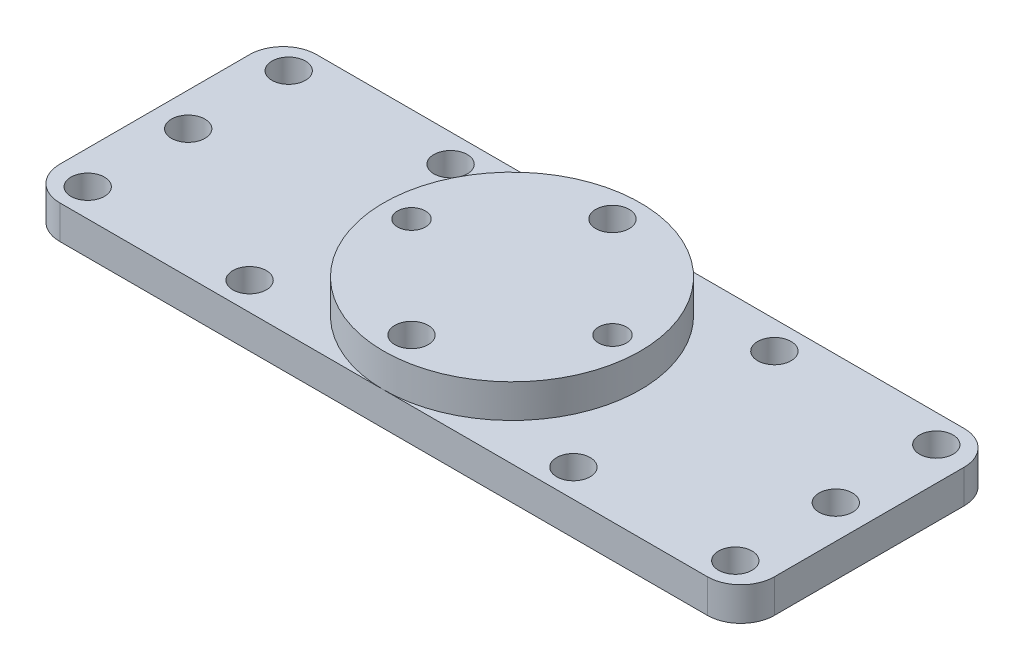
ISO-10303-21;
HEADER;
FILE_DESCRIPTION(('STEP AP214'),'2;1');
FILE_NAME('part.step','',(''),(''),'','','');
FILE_SCHEMA(('AUTOMOTIVE_DESIGN { 1 0 10303 214 1 1 1 1 }'));
ENDSEC;
DATA;
#1=APPLICATION_CONTEXT('core data for automotive mechanical design processes');
#2=APPLICATION_PROTOCOL_DEFINITION('international standard','automotive_design',2000,#1);
#3=PRODUCT_CONTEXT('',#1,'mechanical');
#4=PRODUCT('Part','Part','',(#3));
#5=PRODUCT_RELATED_PRODUCT_CATEGORY('part','',(#4));
#6=PRODUCT_DEFINITION_FORMATION('','',#4);
#7=PRODUCT_DEFINITION_CONTEXT('part definition',#1,'design');
#8=PRODUCT_DEFINITION('design','',#6,#7);
#9=PRODUCT_DEFINITION_SHAPE('','',#8);
#10=(LENGTH_UNIT() NAMED_UNIT(*) SI_UNIT(.MILLI.,.METRE.));
#11=(NAMED_UNIT(*) PLANE_ANGLE_UNIT() SI_UNIT($,.RADIAN.));
#12=(NAMED_UNIT(*) SI_UNIT($,.STERADIAN.) SOLID_ANGLE_UNIT());
#13=UNCERTAINTY_MEASURE_WITH_UNIT(LENGTH_MEASURE(1.E-05),#10,'distance_accuracy_value','');
#14=(GEOMETRIC_REPRESENTATION_CONTEXT(3) GLOBAL_UNCERTAINTY_ASSIGNED_CONTEXT((#13)) GLOBAL_UNIT_ASSIGNED_CONTEXT((#10,
#11,#12)) REPRESENTATION_CONTEXT('',''));
#15=CARTESIAN_POINT('',(0.,0.,0.));
#16=DIRECTION('',(0.,0.,1.));
#17=DIRECTION('',(1.,0.,0.));
#18=AXIS2_PLACEMENT_3D('',#15,#16,#17);
#19=CARTESIAN_POINT('',(0.,0.,0.));
#20=DIRECTION('',(0.,-1.,0.));
#21=DIRECTION('',(0.,0.,-1.));
#22=AXIS2_PLACEMENT_3D('',#19,#20,#21);
#23=PLANE('',#22);
#24=CARTESIAN_POINT('',(0.,0.,0.));
#25=DIRECTION('',(0.,1.,0.));
#26=DIRECTION('',(0.,0.,1.));
#27=AXIS2_PLACEMENT_3D('',#24,#25,#26);
#28=CIRCLE('',#27,11.5);
#29=CARTESIAN_POINT('',(0.,0.,11.5));
#30=VERTEX_POINT('',#29);
#31=CARTESIAN_POINT('',(0.,0.,-11.5));
#32=VERTEX_POINT('',#31);
#33=EDGE_CURVE('E66',#30,#32,#28,.T.);
#34=ORIENTED_EDGE('',*,*,#33,.F.);
#35=DIRECTION('',(1.,0.,0.));
#36=VECTOR('',#35,1.);
#37=CARTESIAN_POINT('',(-32.,0.,11.5));
#38=LINE('',#37,#36);
#39=CARTESIAN_POINT('',(29.,0.,11.5));
#40=VERTEX_POINT('',#39);
#41=EDGE_CURVE('E292',#30,#40,#38,.T.);
#42=ORIENTED_EDGE('',*,*,#41,.T.);
#43=CARTESIAN_POINT('',(29.,0.,8.5));
#44=DIRECTION('',(0.,-1.,0.));
#45=DIRECTION('',(0.,0.,-1.));
#46=AXIS2_PLACEMENT_3D('',#43,#44,#45);
#47=CIRCLE('',#46,3.);
#48=CARTESIAN_POINT('',(32.,0.,8.5));
#49=VERTEX_POINT('',#48);
#50=EDGE_CURVE('E304',#40,#49,#47,.F.);
#51=ORIENTED_EDGE('',*,*,#50,.T.);
#52=DIRECTION('',(0.,0.,-1.));
#53=VECTOR('',#52,1.);
#54=CARTESIAN_POINT('',(32.,0.,11.5));
#55=LINE('',#54,#53);
#56=CARTESIAN_POINT('',(32.,0.,-8.5));
#57=VERTEX_POINT('',#56);
#58=EDGE_CURVE('E262',#49,#57,#55,.T.);
#59=ORIENTED_EDGE('',*,*,#58,.T.);
#60=CARTESIAN_POINT('',(29.,0.,-8.5));
#61=DIRECTION('',(0.,-1.,0.));
#62=DIRECTION('',(0.,0.,-1.));
#63=AXIS2_PLACEMENT_3D('',#60,#61,#62);
#64=CIRCLE('',#63,3.);
#65=CARTESIAN_POINT('',(29.,0.,-11.5));
#66=VERTEX_POINT('',#65);
#67=EDGE_CURVE('E307',#57,#66,#64,.F.);
#68=ORIENTED_EDGE('',*,*,#67,.T.);
#69=DIRECTION('',(-1.,0.,0.));
#70=VECTOR('',#69,1.);
#71=CARTESIAN_POINT('',(-32.,0.,-11.5));
#72=LINE('',#71,#70);
#73=EDGE_CURVE('E284',#66,#32,#72,.T.);
#74=ORIENTED_EDGE('',*,*,#73,.T.);
#75=EDGE_LOOP('',(#34,#42,#51,#59,#68,#74));
#76=FACE_BOUND('',#75,.T.);
#77=CARTESIAN_POINT('',(29.,0.,-9.));
#78=DIRECTION('',(0.,1.,0.));
#79=DIRECTION('',(0.,0.,1.));
#80=AXIS2_PLACEMENT_3D('',#77,#78,#79);
#81=CIRCLE('',#80,1.49999999999999);
#82=CARTESIAN_POINT('',(29.,0.,-7.50000000000001));
#83=VERTEX_POINT('',#82);
#84=EDGE_CURVE('E190',#83,#83,#81,.T.);
#85=ORIENTED_EDGE('',*,*,#84,.F.);
#86=EDGE_LOOP('',(#85));
#87=FACE_BOUND('',#86,.T.);
#88=CARTESIAN_POINT('',(14.5,0.,-9.));
#89=DIRECTION('',(0.,1.,0.));
#90=DIRECTION('',(0.,0.,1.));
#91=AXIS2_PLACEMENT_3D('',#88,#89,#90);
#92=CIRCLE('',#91,1.49999999999999);
#93=CARTESIAN_POINT('',(14.5,0.,-7.50000000000001));
#94=VERTEX_POINT('',#93);
#95=EDGE_CURVE('E198',#94,#94,#92,.T.);
#96=ORIENTED_EDGE('',*,*,#95,.F.);
#97=EDGE_LOOP('',(#96));
#98=FACE_BOUND('',#97,.T.);
#99=CARTESIAN_POINT('',(29.,0.,9.));
#100=DIRECTION('',(0.,1.,0.));
#101=DIRECTION('',(0.,0.,1.));
#102=AXIS2_PLACEMENT_3D('',#99,#100,#101);
#103=CIRCLE('',#102,1.49999999999999);
#104=CARTESIAN_POINT('',(29.,0.,10.5));
#105=VERTEX_POINT('',#104);
#106=EDGE_CURVE('E214',#105,#105,#103,.T.);
#107=ORIENTED_EDGE('',*,*,#106,.F.);
#108=EDGE_LOOP('',(#107));
#109=FACE_BOUND('',#108,.T.);
#110=CARTESIAN_POINT('',(14.5,0.,9.));
#111=DIRECTION('',(0.,1.,0.));
#112=DIRECTION('',(0.,0.,1.));
#113=AXIS2_PLACEMENT_3D('',#110,#111,#112);
#114=CIRCLE('',#113,1.49999999999999);
#115=CARTESIAN_POINT('',(14.5,0.,10.5));
#116=VERTEX_POINT('',#115);
#117=EDGE_CURVE('E206',#116,#116,#114,.T.);
#118=ORIENTED_EDGE('',*,*,#117,.F.);
#119=EDGE_LOOP('',(#118));
#120=FACE_BOUND('',#119,.T.);
#121=CARTESIAN_POINT('',(29.,0.,0.));
#122=DIRECTION('',(0.,1.,0.));
#123=DIRECTION('',(0.,0.,1.));
#124=AXIS2_PLACEMENT_3D('',#121,#122,#123);
#125=CIRCLE('',#124,1.49999999999999);
#126=CARTESIAN_POINT('',(29.,0.,1.49999999999999));
#127=VERTEX_POINT('',#126);
#128=EDGE_CURVE('E179',#127,#127,#125,.T.);
#129=ORIENTED_EDGE('',*,*,#128,.F.);
#130=EDGE_LOOP('',(#129));
#131=FACE_BOUND('',#130,.T.);
#132=ADVANCED_FACE('F55',(#76,#87,#98,#109,#120,#131),#23,.F.);
#133=EDGE_CURVE('E11',#32,#30,#28,.T.);
#134=ORIENTED_EDGE('',*,*,#133,.F.);
#135=CARTESIAN_POINT('',(-29.,0.,-11.5));
#136=VERTEX_POINT('',#135);
#137=EDGE_CURVE('E283',#32,#136,#72,.T.);
#138=ORIENTED_EDGE('',*,*,#137,.T.);
#139=CARTESIAN_POINT('',(-29.,0.,-8.5));
#140=DIRECTION('',(0.,-1.,0.));
#141=DIRECTION('',(0.,0.,-1.));
#142=AXIS2_PLACEMENT_3D('',#139,#140,#141);
#143=CIRCLE('',#142,3.);
#144=CARTESIAN_POINT('',(-32.,0.,-8.5));
#145=VERTEX_POINT('',#144);
#146=EDGE_CURVE('E310',#136,#145,#143,.F.);
#147=ORIENTED_EDGE('',*,*,#146,.T.);
#148=DIRECTION('',(0.,0.,1.));
#149=VECTOR('',#148,1.);
#150=CARTESIAN_POINT('',(-32.,0.,11.5));
#151=LINE('',#150,#149);
#152=CARTESIAN_POINT('',(-32.,0.,8.5));
#153=VERTEX_POINT('',#152);
#154=EDGE_CURVE('E288',#145,#153,#151,.T.);
#155=ORIENTED_EDGE('',*,*,#154,.T.);
#156=CARTESIAN_POINT('',(-29.,0.,8.5));
#157=DIRECTION('',(0.,-1.,0.));
#158=DIRECTION('',(0.,0.,-1.));
#159=AXIS2_PLACEMENT_3D('',#156,#157,#158);
#160=CIRCLE('',#159,3.);
#161=CARTESIAN_POINT('',(-29.,0.,11.5));
#162=VERTEX_POINT('',#161);
#163=EDGE_CURVE('E301',#153,#162,#160,.F.);
#164=ORIENTED_EDGE('',*,*,#163,.T.);
#165=EDGE_CURVE('E268',#162,#30,#38,.T.);
#166=ORIENTED_EDGE('',*,*,#165,.T.);
#167=EDGE_LOOP('',(#134,#138,#147,#155,#164,#166));
#168=FACE_BOUND('',#167,.T.);
#169=CARTESIAN_POINT('',(-29.,0.,9.));
#170=DIRECTION('',(0.,1.,0.));
#171=DIRECTION('',(0.,0.,1.));
#172=AXIS2_PLACEMENT_3D('',#169,#170,#171);
#173=CIRCLE('',#172,1.49999999999999);
#174=CARTESIAN_POINT('',(-29.,0.,10.5));
#175=VERTEX_POINT('',#174);
#176=EDGE_CURVE('E254',#175,#175,#173,.T.);
#177=ORIENTED_EDGE('',*,*,#176,.F.);
#178=EDGE_LOOP('',(#177));
#179=FACE_BOUND('',#178,.T.);
#180=CARTESIAN_POINT('',(-14.5,0.,9.));
#181=DIRECTION('',(0.,1.,0.));
#182=DIRECTION('',(0.,0.,1.));
#183=AXIS2_PLACEMENT_3D('',#180,#181,#182);
#184=CIRCLE('',#183,1.49999999999999);
#185=CARTESIAN_POINT('',(-14.5,0.,10.5));
#186=VERTEX_POINT('',#185);
#187=EDGE_CURVE('E246',#186,#186,#184,.T.);
#188=ORIENTED_EDGE('',*,*,#187,.F.);
#189=EDGE_LOOP('',(#188));
#190=FACE_BOUND('',#189,.T.);
#191=CARTESIAN_POINT('',(-14.5,0.,-9.));
#192=DIRECTION('',(0.,1.,0.));
#193=DIRECTION('',(0.,0.,1.));
#194=AXIS2_PLACEMENT_3D('',#191,#192,#193);
#195=CIRCLE('',#194,1.49999999999999);
#196=CARTESIAN_POINT('',(-14.5,0.,-7.50000000000001));
#197=VERTEX_POINT('',#196);
#198=EDGE_CURVE('E238',#197,#197,#195,.T.);
#199=ORIENTED_EDGE('',*,*,#198,.F.);
#200=EDGE_LOOP('',(#199));
#201=FACE_BOUND('',#200,.T.);
#202=CARTESIAN_POINT('',(-29.,0.,-9.));
#203=DIRECTION('',(0.,1.,0.));
#204=DIRECTION('',(0.,0.,1.));
#205=AXIS2_PLACEMENT_3D('',#202,#203,#204);
#206=CIRCLE('',#205,1.49999999999999);
#207=CARTESIAN_POINT('',(-29.,0.,-7.50000000000001));
#208=VERTEX_POINT('',#207);
#209=EDGE_CURVE('E230',#208,#208,#206,.T.);
#210=ORIENTED_EDGE('',*,*,#209,.F.);
#211=EDGE_LOOP('',(#210));
#212=FACE_BOUND('',#211,.T.);
#213=CARTESIAN_POINT('',(-29.,0.,0.));
#214=DIRECTION('',(0.,1.,0.));
#215=DIRECTION('',(0.,0.,1.));
#216=AXIS2_PLACEMENT_3D('',#213,#214,#215);
#217=CIRCLE('',#216,1.49999999999999);
#218=CARTESIAN_POINT('',(-29.,0.,1.49999999999999));
#219=VERTEX_POINT('',#218);
#220=EDGE_CURVE('E222',#219,#219,#217,.T.);
#221=ORIENTED_EDGE('',*,*,#220,.F.);
#222=EDGE_LOOP('',(#221));
#223=FACE_BOUND('',#222,.T.);
#224=ADVANCED_FACE('F482',(#168,#179,#190,#201,#212,#223),#23,.F.);
#225=CARTESIAN_POINT('',(32.,-3.,11.5));
#226=DIRECTION('',(1.,0.,0.));
#227=DIRECTION('',(0.,0.,-1.));
#228=AXIS2_PLACEMENT_3D('',#225,#226,#227);
#229=PLANE('',#228);
#230=DIRECTION('',(0.,0.,-1.));
#231=VECTOR('',#230,1.);
#232=CARTESIAN_POINT('',(32.,-3.,11.5));
#233=LINE('',#232,#231);
#234=CARTESIAN_POINT('',(32.,-3.,8.5));
#235=VERTEX_POINT('',#234);
#236=CARTESIAN_POINT('',(32.,-3.,-8.5));
#237=VERTEX_POINT('',#236);
#238=EDGE_CURVE('E263',#235,#237,#233,.T.);
#239=ORIENTED_EDGE('',*,*,#238,.T.);
#240=DIRECTION('',(0.,1.,0.));
#241=VECTOR('',#240,1.);
#242=CARTESIAN_POINT('',(32.,-3.,-8.5));
#243=LINE('',#242,#241);
#244=EDGE_CURVE('E334',#237,#57,#243,.T.);
#245=ORIENTED_EDGE('',*,*,#244,.T.);
#246=ORIENTED_EDGE('',*,*,#58,.F.);
#247=DIRECTION('',(0.,1.,0.));
#248=VECTOR('',#247,1.);
#249=CARTESIAN_POINT('',(32.,-3.,8.5));
#250=LINE('',#249,#248);
#251=EDGE_CURVE('E331',#49,#235,#250,.F.);
#252=ORIENTED_EDGE('',*,*,#251,.T.);
#253=EDGE_LOOP('',(#239,#245,#246,#252));
#254=FACE_BOUND('',#253,.T.);
#255=ADVANCED_FACE('F360',(#254),#229,.T.);
#256=CARTESIAN_POINT('',(-32.,-3.,11.5));
#257=DIRECTION('',(0.,0.,1.));
#258=DIRECTION('',(1.,0.,0.));
#259=AXIS2_PLACEMENT_3D('',#256,#257,#258);
#260=PLANE('',#259);
#261=DIRECTION('',(1.,0.,0.));
#262=VECTOR('',#261,1.);
#263=CARTESIAN_POINT('',(-32.,-3.,11.5));
#264=LINE('',#263,#262);
#265=CARTESIAN_POINT('',(-29.,-3.,11.5));
#266=VERTEX_POINT('',#265);
#267=CARTESIAN_POINT('',(29.,-3.,11.5));
#268=VERTEX_POINT('',#267);
#269=EDGE_CURVE('E276',#266,#268,#264,.T.);
#270=ORIENTED_EDGE('',*,*,#269,.T.);
#271=DIRECTION('',(0.,1.,0.));
#272=VECTOR('',#271,1.);
#273=CARTESIAN_POINT('',(29.,-3.,11.5));
#274=LINE('',#273,#272);
#275=EDGE_CURVE('E59',#268,#40,#274,.T.);
#276=ORIENTED_EDGE('',*,*,#275,.T.);
#277=ORIENTED_EDGE('',*,*,#41,.F.);
#278=ORIENTED_EDGE('',*,*,#165,.F.);
#279=DIRECTION('',(0.,1.,0.));
#280=VECTOR('',#279,1.);
#281=CARTESIAN_POINT('',(-29.,-3.,11.5));
#282=LINE('',#281,#280);
#283=EDGE_CURVE('E337',#162,#266,#282,.F.);
#284=ORIENTED_EDGE('',*,*,#283,.T.);
#285=EDGE_LOOP('',(#270,#276,#277,#278,#284));
#286=FACE_BOUND('',#285,.T.);
#287=ADVANCED_FACE('F350',(#286),#260,.T.);
#288=CARTESIAN_POINT('',(-32.,-3.,11.5));
#289=DIRECTION('',(-1.,0.,0.));
#290=DIRECTION('',(0.,0.,1.));
#291=AXIS2_PLACEMENT_3D('',#288,#289,#290);
#292=PLANE('',#291);
#293=ORIENTED_EDGE('',*,*,#154,.F.);
#294=DIRECTION('',(0.,1.,0.));
#295=VECTOR('',#294,1.);
#296=CARTESIAN_POINT('',(-32.,-3.,-8.5));
#297=LINE('',#296,#295);
#298=CARTESIAN_POINT('',(-32.,-3.,-8.5));
#299=VERTEX_POINT('',#298);
#300=EDGE_CURVE('E317',#145,#299,#297,.F.);
#301=ORIENTED_EDGE('',*,*,#300,.T.);
#302=DIRECTION('',(0.,0.,1.));
#303=VECTOR('',#302,1.);
#304=CARTESIAN_POINT('',(-32.,-3.,11.5));
#305=LINE('',#304,#303);
#306=CARTESIAN_POINT('',(-32.,-3.,8.5));
#307=VERTEX_POINT('',#306);
#308=EDGE_CURVE('E272',#299,#307,#305,.T.);
#309=ORIENTED_EDGE('',*,*,#308,.T.);
#310=DIRECTION('',(0.,1.,0.));
#311=VECTOR('',#310,1.);
#312=CARTESIAN_POINT('',(-32.,-3.,8.5));
#313=LINE('',#312,#311);
#314=EDGE_CURVE('E313',#307,#153,#313,.T.);
#315=ORIENTED_EDGE('',*,*,#314,.T.);
#316=EDGE_LOOP('',(#293,#301,#309,#315));
#317=FACE_BOUND('',#316,.T.);
#318=ADVANCED_FACE('F491',(#317),#292,.T.);
#319=CARTESIAN_POINT('',(-32.,-3.,-11.5));
#320=DIRECTION('',(0.,0.,-1.));
#321=DIRECTION('',(-1.,0.,0.));
#322=AXIS2_PLACEMENT_3D('',#319,#320,#321);
#323=PLANE('',#322);
#324=DIRECTION('',(-1.,0.,0.));
#325=VECTOR('',#324,1.);
#326=CARTESIAN_POINT('',(-32.,-3.,-11.5));
#327=LINE('',#326,#325);
#328=CARTESIAN_POINT('',(29.,-3.,-11.5));
#329=VERTEX_POINT('',#328);
#330=CARTESIAN_POINT('',(-29.,-3.,-11.5));
#331=VERTEX_POINT('',#330);
#332=EDGE_CURVE('E267',#329,#331,#327,.T.);
#333=ORIENTED_EDGE('',*,*,#332,.T.);
#334=DIRECTION('',(0.,1.,0.));
#335=VECTOR('',#334,1.);
#336=CARTESIAN_POINT('',(-29.,-3.,-11.5));
#337=LINE('',#336,#335);
#338=EDGE_CURVE('E297',#331,#136,#337,.T.);
#339=ORIENTED_EDGE('',*,*,#338,.T.);
#340=ORIENTED_EDGE('',*,*,#137,.F.);
#341=ORIENTED_EDGE('',*,*,#73,.F.);
#342=DIRECTION('',(0.,1.,0.));
#343=VECTOR('',#342,1.);
#344=CARTESIAN_POINT('',(29.,-3.,-11.5));
#345=LINE('',#344,#343);
#346=EDGE_CURVE('E279',#66,#329,#345,.F.);
#347=ORIENTED_EDGE('',*,*,#346,.T.);
#348=EDGE_LOOP('',(#333,#339,#340,#341,#347));
#349=FACE_BOUND('',#348,.T.);
#350=ADVANCED_FACE('F368',(#349),#323,.T.);
#351=CARTESIAN_POINT('',(0.,-3.,0.));
#352=DIRECTION('',(0.,-1.,0.));
#353=DIRECTION('',(0.,0.,-1.));
#354=AXIS2_PLACEMENT_3D('',#351,#352,#353);
#355=PLANE('',#354);
#356=CARTESIAN_POINT('',(0.,-3.,-9.));
#357=DIRECTION('',(0.,-1.,0.));
#358=DIRECTION('',(0.,0.,-1.));
#359=AXIS2_PLACEMENT_3D('',#356,#357,#358);
#360=CIRCLE('',#359,1.49999999999999);
#361=CARTESIAN_POINT('',(0.,-3.,-10.5));
#362=VERTEX_POINT('',#361);
#363=EDGE_CURVE('E164',#362,#362,#360,.T.);
#364=ORIENTED_EDGE('',*,*,#363,.F.);
#365=EDGE_LOOP('',(#364));
#366=FACE_BOUND('',#365,.T.);
#367=CARTESIAN_POINT('',(0.,-3.,9.));
#368=DIRECTION('',(0.,-1.,0.));
#369=DIRECTION('',(0.,0.,-1.));
#370=AXIS2_PLACEMENT_3D('',#367,#368,#369);
#371=CIRCLE('',#370,1.49999999999999);
#372=CARTESIAN_POINT('',(0.,-3.,7.50000000000001));
#373=VERTEX_POINT('',#372);
#374=EDGE_CURVE('E172',#373,#373,#371,.T.);
#375=ORIENTED_EDGE('',*,*,#374,.F.);
#376=EDGE_LOOP('',(#375));
#377=FACE_BOUND('',#376,.T.);
#378=CARTESIAN_POINT('',(29.,-3.,0.));
#379=DIRECTION('',(0.,-1.,0.));
#380=DIRECTION('',(0.,0.,-1.));
#381=AXIS2_PLACEMENT_3D('',#378,#379,#380);
#382=CIRCLE('',#381,1.49999999999999);
#383=CARTESIAN_POINT('',(29.,-3.,-1.49999999999999));
#384=VERTEX_POINT('',#383);
#385=EDGE_CURVE('E186',#384,#384,#382,.T.);
#386=ORIENTED_EDGE('',*,*,#385,.F.);
#387=EDGE_LOOP('',(#386));
#388=FACE_BOUND('',#387,.T.);
#389=CARTESIAN_POINT('',(29.,-3.,-9.));
#390=DIRECTION('',(0.,-1.,0.));
#391=DIRECTION('',(0.,0.,-1.));
#392=AXIS2_PLACEMENT_3D('',#389,#390,#391);
#393=CIRCLE('',#392,1.49999999999999);
#394=CARTESIAN_POINT('',(29.,-3.,-10.5));
#395=VERTEX_POINT('',#394);
#396=EDGE_CURVE('E194',#395,#395,#393,.T.);
#397=ORIENTED_EDGE('',*,*,#396,.F.);
#398=EDGE_LOOP('',(#397));
#399=FACE_BOUND('',#398,.T.);
#400=CARTESIAN_POINT('',(14.5,-3.,-9.));
#401=DIRECTION('',(0.,-1.,0.));
#402=DIRECTION('',(0.,0.,-1.));
#403=AXIS2_PLACEMENT_3D('',#400,#401,#402);
#404=CIRCLE('',#403,1.49999999999999);
#405=CARTESIAN_POINT('',(14.5,-3.,-10.5));
#406=VERTEX_POINT('',#405);
#407=EDGE_CURVE('E202',#406,#406,#404,.T.);
#408=ORIENTED_EDGE('',*,*,#407,.F.);
#409=EDGE_LOOP('',(#408));
#410=FACE_BOUND('',#409,.T.);
#411=CARTESIAN_POINT('',(14.5,-3.,9.));
#412=DIRECTION('',(0.,-1.,0.));
#413=DIRECTION('',(0.,0.,-1.));
#414=AXIS2_PLACEMENT_3D('',#411,#412,#413);
#415=CIRCLE('',#414,1.49999999999999);
#416=CARTESIAN_POINT('',(14.5,-3.,7.50000000000001));
#417=VERTEX_POINT('',#416);
#418=EDGE_CURVE('E210',#417,#417,#415,.T.);
#419=ORIENTED_EDGE('',*,*,#418,.F.);
#420=EDGE_LOOP('',(#419));
#421=FACE_BOUND('',#420,.T.);
#422=CARTESIAN_POINT('',(29.,-3.,9.));
#423=DIRECTION('',(0.,-1.,0.));
#424=DIRECTION('',(0.,0.,-1.));
#425=AXIS2_PLACEMENT_3D('',#422,#423,#424);
#426=CIRCLE('',#425,1.49999999999999);
#427=CARTESIAN_POINT('',(29.,-3.,7.50000000000001));
#428=VERTEX_POINT('',#427);
#429=EDGE_CURVE('E218',#428,#428,#426,.T.);
#430=ORIENTED_EDGE('',*,*,#429,.F.);
#431=EDGE_LOOP('',(#430));
#432=FACE_BOUND('',#431,.T.);
#433=CARTESIAN_POINT('',(-29.,-3.,0.));
#434=DIRECTION('',(0.,-1.,0.));
#435=DIRECTION('',(0.,0.,-1.));
#436=AXIS2_PLACEMENT_3D('',#433,#434,#435);
#437=CIRCLE('',#436,1.49999999999999);
#438=CARTESIAN_POINT('',(-29.,-3.,-1.49999999999999));
#439=VERTEX_POINT('',#438);
#440=EDGE_CURVE('E226',#439,#439,#437,.T.);
#441=ORIENTED_EDGE('',*,*,#440,.F.);
#442=EDGE_LOOP('',(#441));
#443=FACE_BOUND('',#442,.T.);
#444=CARTESIAN_POINT('',(-29.,-3.,-9.));
#445=DIRECTION('',(0.,-1.,0.));
#446=DIRECTION('',(0.,0.,-1.));
#447=AXIS2_PLACEMENT_3D('',#444,#445,#446);
#448=CIRCLE('',#447,1.49999999999999);
#449=CARTESIAN_POINT('',(-29.,-3.,-10.5));
#450=VERTEX_POINT('',#449);
#451=EDGE_CURVE('E234',#450,#450,#448,.T.);
#452=ORIENTED_EDGE('',*,*,#451,.F.);
#453=EDGE_LOOP('',(#452));
#454=FACE_BOUND('',#453,.T.);
#455=CARTESIAN_POINT('',(-14.5,-3.,-9.));
#456=DIRECTION('',(0.,-1.,0.));
#457=DIRECTION('',(0.,0.,-1.));
#458=AXIS2_PLACEMENT_3D('',#455,#456,#457);
#459=CIRCLE('',#458,1.49999999999999);
#460=CARTESIAN_POINT('',(-14.5,-3.,-10.5));
#461=VERTEX_POINT('',#460);
#462=EDGE_CURVE('E242',#461,#461,#459,.T.);
#463=ORIENTED_EDGE('',*,*,#462,.F.);
#464=EDGE_LOOP('',(#463));
#465=FACE_BOUND('',#464,.T.);
#466=CARTESIAN_POINT('',(-14.5,-3.,9.));
#467=DIRECTION('',(0.,-1.,0.));
#468=DIRECTION('',(0.,0.,-1.));
#469=AXIS2_PLACEMENT_3D('',#466,#467,#468);
#470=CIRCLE('',#469,1.49999999999999);
#471=CARTESIAN_POINT('',(-14.5,-3.,7.50000000000001));
#472=VERTEX_POINT('',#471);
#473=EDGE_CURVE('E250',#472,#472,#470,.T.);
#474=ORIENTED_EDGE('',*,*,#473,.F.);
#475=EDGE_LOOP('',(#474));
#476=FACE_BOUND('',#475,.T.);
#477=CARTESIAN_POINT('',(-29.,-3.,9.));
#478=DIRECTION('',(0.,-1.,0.));
#479=DIRECTION('',(0.,0.,-1.));
#480=AXIS2_PLACEMENT_3D('',#477,#478,#479);
#481=CIRCLE('',#480,1.49999999999999);
#482=CARTESIAN_POINT('',(-29.,-3.,7.50000000000001));
#483=VERTEX_POINT('',#482);
#484=EDGE_CURVE('E258',#483,#483,#481,.T.);
#485=ORIENTED_EDGE('',*,*,#484,.F.);
#486=EDGE_LOOP('',(#485));
#487=FACE_BOUND('',#486,.T.);
#488=ORIENTED_EDGE('',*,*,#308,.F.);
#489=CARTESIAN_POINT('',(-29.,-3.,-8.5));
#490=DIRECTION('',(0.,-1.,0.));
#491=DIRECTION('',(0.,0.,-1.));
#492=AXIS2_PLACEMENT_3D('',#489,#490,#491);
#493=CIRCLE('',#492,3.);
#494=EDGE_CURVE('E328',#299,#331,#493,.T.);
#495=ORIENTED_EDGE('',*,*,#494,.T.);
#496=ORIENTED_EDGE('',*,*,#332,.F.);
#497=CARTESIAN_POINT('',(29.,-3.,-8.5));
#498=DIRECTION('',(0.,-1.,0.));
#499=DIRECTION('',(0.,0.,-1.));
#500=AXIS2_PLACEMENT_3D('',#497,#498,#499);
#501=CIRCLE('',#500,3.);
#502=EDGE_CURVE('E325',#329,#237,#501,.T.);
#503=ORIENTED_EDGE('',*,*,#502,.T.);
#504=ORIENTED_EDGE('',*,*,#238,.F.);
#505=CARTESIAN_POINT('',(29.,-3.,8.5));
#506=DIRECTION('',(0.,-1.,0.));
#507=DIRECTION('',(0.,0.,-1.));
#508=AXIS2_PLACEMENT_3D('',#505,#506,#507);
#509=CIRCLE('',#508,3.);
#510=EDGE_CURVE('E79',#235,#268,#509,.T.);
#511=ORIENTED_EDGE('',*,*,#510,.T.);
#512=ORIENTED_EDGE('',*,*,#269,.F.);
#513=CARTESIAN_POINT('',(-29.,-3.,8.5));
#514=DIRECTION('',(0.,-1.,0.));
#515=DIRECTION('',(0.,0.,-1.));
#516=AXIS2_PLACEMENT_3D('',#513,#514,#515);
#517=CIRCLE('',#516,3.);
#518=EDGE_CURVE('E320',#266,#307,#517,.T.);
#519=ORIENTED_EDGE('',*,*,#518,.T.);
#520=EDGE_LOOP('',(#488,#495,#496,#503,#504,#511,#512,#519));
#521=FACE_BOUND('',#520,.T.);
#522=ADVANCED_FACE('F493',(#366,#377,#388,#399,#410,#421,#432,#443,#454,#465,#476,#487,#521),
#355,.T.);
#523=CARTESIAN_POINT('',(-29.,0.,9.));
#524=DIRECTION('',(0.,1.,0.));
#525=DIRECTION('',(0.,0.,1.));
#526=AXIS2_PLACEMENT_3D('',#523,#524,#525);
#527=CYLINDRICAL_SURFACE('',#526,1.49999999999999);
#528=ORIENTED_EDGE('',*,*,#176,.T.);
#529=EDGE_LOOP('',(#528));
#530=FACE_BOUND('',#529,.T.);
#531=ORIENTED_EDGE('',*,*,#484,.T.);
#532=EDGE_LOOP('',(#531));
#533=FACE_BOUND('',#532,.T.);
#534=ADVANCED_FACE('F674',(#530,#533),#527,.F.);
#535=CARTESIAN_POINT('',(-14.5,0.,9.));
#536=DIRECTION('',(0.,1.,0.));
#537=DIRECTION('',(0.,0.,1.));
#538=AXIS2_PLACEMENT_3D('',#535,#536,#537);
#539=CYLINDRICAL_SURFACE('',#538,1.49999999999999);
#540=ORIENTED_EDGE('',*,*,#187,.T.);
#541=EDGE_LOOP('',(#540));
#542=FACE_BOUND('',#541,.T.);
#543=ORIENTED_EDGE('',*,*,#473,.T.);
#544=EDGE_LOOP('',(#543));
#545=FACE_BOUND('',#544,.T.);
#546=ADVANCED_FACE('F671',(#542,#545),#539,.F.);
#547=CARTESIAN_POINT('',(-14.5,0.,-9.));
#548=DIRECTION('',(0.,1.,0.));
#549=DIRECTION('',(0.,0.,1.));
#550=AXIS2_PLACEMENT_3D('',#547,#548,#549);
#551=CYLINDRICAL_SURFACE('',#550,1.49999999999999);
#552=ORIENTED_EDGE('',*,*,#198,.T.);
#553=EDGE_LOOP('',(#552));
#554=FACE_BOUND('',#553,.T.);
#555=ORIENTED_EDGE('',*,*,#462,.T.);
#556=EDGE_LOOP('',(#555));
#557=FACE_BOUND('',#556,.T.);
#558=ADVANCED_FACE('F667',(#554,#557),#551,.F.);
#559=CARTESIAN_POINT('',(-29.,0.,-9.));
#560=DIRECTION('',(0.,1.,0.));
#561=DIRECTION('',(0.,0.,1.));
#562=AXIS2_PLACEMENT_3D('',#559,#560,#561);
#563=CYLINDRICAL_SURFACE('',#562,1.49999999999999);
#564=ORIENTED_EDGE('',*,*,#209,.T.);
#565=EDGE_LOOP('',(#564));
#566=FACE_BOUND('',#565,.T.);
#567=ORIENTED_EDGE('',*,*,#451,.T.);
#568=EDGE_LOOP('',(#567));
#569=FACE_BOUND('',#568,.T.);
#570=ADVANCED_FACE('F663',(#566,#569),#563,.F.);
#571=CARTESIAN_POINT('',(-29.,0.,0.));
#572=DIRECTION('',(0.,1.,0.));
#573=DIRECTION('',(0.,0.,1.));
#574=AXIS2_PLACEMENT_3D('',#571,#572,#573);
#575=CYLINDRICAL_SURFACE('',#574,1.49999999999999);
#576=ORIENTED_EDGE('',*,*,#220,.T.);
#577=EDGE_LOOP('',(#576));
#578=FACE_BOUND('',#577,.T.);
#579=ORIENTED_EDGE('',*,*,#440,.T.);
#580=EDGE_LOOP('',(#579));
#581=FACE_BOUND('',#580,.T.);
#582=ADVANCED_FACE('F659',(#578,#581),#575,.F.);
#583=CARTESIAN_POINT('',(29.,0.,9.));
#584=DIRECTION('',(0.,1.,0.));
#585=DIRECTION('',(0.,0.,1.));
#586=AXIS2_PLACEMENT_3D('',#583,#584,#585);
#587=CYLINDRICAL_SURFACE('',#586,1.49999999999999);
#588=ORIENTED_EDGE('',*,*,#106,.T.);
#589=EDGE_LOOP('',(#588));
#590=FACE_BOUND('',#589,.T.);
#591=ORIENTED_EDGE('',*,*,#429,.T.);
#592=EDGE_LOOP('',(#591));
#593=FACE_BOUND('',#592,.T.);
#594=ADVANCED_FACE('F655',(#590,#593),#587,.F.);
#595=CARTESIAN_POINT('',(14.5,0.,9.));
#596=DIRECTION('',(0.,1.,0.));
#597=DIRECTION('',(0.,0.,1.));
#598=AXIS2_PLACEMENT_3D('',#595,#596,#597);
#599=CYLINDRICAL_SURFACE('',#598,1.49999999999999);
#600=ORIENTED_EDGE('',*,*,#117,.T.);
#601=EDGE_LOOP('',(#600));
#602=FACE_BOUND('',#601,.T.);
#603=ORIENTED_EDGE('',*,*,#418,.T.);
#604=EDGE_LOOP('',(#603));
#605=FACE_BOUND('',#604,.T.);
#606=ADVANCED_FACE('F651',(#602,#605),#599,.F.);
#607=CARTESIAN_POINT('',(14.5,0.,-9.));
#608=DIRECTION('',(0.,1.,0.));
#609=DIRECTION('',(0.,0.,1.));
#610=AXIS2_PLACEMENT_3D('',#607,#608,#609);
#611=CYLINDRICAL_SURFACE('',#610,1.49999999999999);
#612=ORIENTED_EDGE('',*,*,#95,.T.);
#613=EDGE_LOOP('',(#612));
#614=FACE_BOUND('',#613,.T.);
#615=ORIENTED_EDGE('',*,*,#407,.T.);
#616=EDGE_LOOP('',(#615));
#617=FACE_BOUND('',#616,.T.);
#618=ADVANCED_FACE('F647',(#614,#617),#611,.F.);
#619=CARTESIAN_POINT('',(29.,0.,-9.));
#620=DIRECTION('',(0.,1.,0.));
#621=DIRECTION('',(0.,0.,1.));
#622=AXIS2_PLACEMENT_3D('',#619,#620,#621);
#623=CYLINDRICAL_SURFACE('',#622,1.49999999999999);
#624=ORIENTED_EDGE('',*,*,#84,.T.);
#625=EDGE_LOOP('',(#624));
#626=FACE_BOUND('',#625,.T.);
#627=ORIENTED_EDGE('',*,*,#396,.T.);
#628=EDGE_LOOP('',(#627));
#629=FACE_BOUND('',#628,.T.);
#630=ADVANCED_FACE('F643',(#626,#629),#623,.F.);
#631=CARTESIAN_POINT('',(29.,0.,0.));
#632=DIRECTION('',(0.,1.,0.));
#633=DIRECTION('',(0.,0.,1.));
#634=AXIS2_PLACEMENT_3D('',#631,#632,#633);
#635=CYLINDRICAL_SURFACE('',#634,1.49999999999999);
#636=ORIENTED_EDGE('',*,*,#128,.T.);
#637=EDGE_LOOP('',(#636));
#638=FACE_BOUND('',#637,.T.);
#639=ORIENTED_EDGE('',*,*,#385,.T.);
#640=EDGE_LOOP('',(#639));
#641=FACE_BOUND('',#640,.T.);
#642=ADVANCED_FACE('F523',(#638,#641),#635,.F.);
#643=CARTESIAN_POINT('',(-29.,-3.,-8.5));
#644=DIRECTION('',(0.,1.,0.));
#645=DIRECTION('',(0.,0.,1.));
#646=AXIS2_PLACEMENT_3D('',#643,#644,#645);
#647=CYLINDRICAL_SURFACE('',#646,3.);
#648=ORIENTED_EDGE('',*,*,#494,.F.);
#649=ORIENTED_EDGE('',*,*,#300,.F.);
#650=ORIENTED_EDGE('',*,*,#146,.F.);
#651=ORIENTED_EDGE('',*,*,#338,.F.);
#652=EDGE_LOOP('',(#648,#649,#650,#651));
#653=FACE_BOUND('',#652,.T.);
#654=ADVANCED_FACE('F488',(#653),#647,.T.);
#655=CARTESIAN_POINT('',(29.,-3.,-8.5));
#656=DIRECTION('',(0.,1.,0.));
#657=DIRECTION('',(0.,0.,1.));
#658=AXIS2_PLACEMENT_3D('',#655,#656,#657);
#659=CYLINDRICAL_SURFACE('',#658,3.);
#660=ORIENTED_EDGE('',*,*,#502,.F.);
#661=ORIENTED_EDGE('',*,*,#346,.F.);
#662=ORIENTED_EDGE('',*,*,#67,.F.);
#663=ORIENTED_EDGE('',*,*,#244,.F.);
#664=EDGE_LOOP('',(#660,#661,#662,#663));
#665=FACE_BOUND('',#664,.T.);
#666=ADVANCED_FACE('F364',(#665),#659,.T.);
#667=CARTESIAN_POINT('',(29.,-3.,8.5));
#668=DIRECTION('',(0.,1.,0.));
#669=DIRECTION('',(0.,0.,1.));
#670=AXIS2_PLACEMENT_3D('',#667,#668,#669);
#671=CYLINDRICAL_SURFACE('',#670,3.);
#672=ORIENTED_EDGE('',*,*,#510,.F.);
#673=ORIENTED_EDGE('',*,*,#251,.F.);
#674=ORIENTED_EDGE('',*,*,#50,.F.);
#675=ORIENTED_EDGE('',*,*,#275,.F.);
#676=EDGE_LOOP('',(#672,#673,#674,#675));
#677=FACE_BOUND('',#676,.T.);
#678=ADVANCED_FACE('F354',(#677),#671,.T.);
#679=CARTESIAN_POINT('',(-29.,-3.,8.5));
#680=DIRECTION('',(0.,1.,0.));
#681=DIRECTION('',(0.,0.,1.));
#682=AXIS2_PLACEMENT_3D('',#679,#680,#681);
#683=CYLINDRICAL_SURFACE('',#682,3.);
#684=ORIENTED_EDGE('',*,*,#518,.F.);
#685=ORIENTED_EDGE('',*,*,#283,.F.);
#686=ORIENTED_EDGE('',*,*,#163,.F.);
#687=ORIENTED_EDGE('',*,*,#314,.F.);
#688=EDGE_LOOP('',(#684,#685,#686,#687));
#689=FACE_BOUND('',#688,.T.);
#690=ADVANCED_FACE('F57',(#689),#683,.T.);
#691=CARTESIAN_POINT('',(0.,3.,0.));
#692=DIRECTION('',(0.,-1.,0.));
#693=DIRECTION('',(0.,0.,-1.));
#694=AXIS2_PLACEMENT_3D('',#691,#692,#693);
#695=CYLINDRICAL_SURFACE('',#694,11.5);
#696=CARTESIAN_POINT('',(0.,3.,0.));
#697=DIRECTION('',(0.,1.,0.));
#698=DIRECTION('',(0.,0.,1.));
#699=AXIS2_PLACEMENT_3D('',#696,#697,#698);
#700=CIRCLE('',#699,11.5);
#701=CARTESIAN_POINT('',(0.,3.,11.5));
#702=VERTEX_POINT('',#701);
#703=EDGE_CURVE('E176',#702,#702,#700,.T.);
#704=ORIENTED_EDGE('',*,*,#703,.F.);
#705=EDGE_LOOP('',(#704));
#706=FACE_BOUND('',#705,.T.);
#707=ORIENTED_EDGE('',*,*,#33,.T.);
#708=ORIENTED_EDGE('',*,*,#133,.T.);
#709=EDGE_LOOP('',(#707,#708));
#710=FACE_BOUND('',#709,.T.);
#711=ADVANCED_FACE('F497',(#706,#710),#695,.T.);
#712=CARTESIAN_POINT('',(0.,3.,0.));
#713=DIRECTION('',(0.,1.,0.));
#714=DIRECTION('',(0.,0.,1.));
#715=AXIS2_PLACEMENT_3D('',#712,#713,#714);
#716=PLANE('',#715);
#717=CARTESIAN_POINT('',(-9.,3.,0.));
#718=DIRECTION('',(0.,1.,0.));
#719=DIRECTION('',(0.,0.,1.));
#720=AXIS2_PLACEMENT_3D('',#717,#718,#719);
#721=CIRCLE('',#720,1.24999999999999);
#722=CARTESIAN_POINT('',(-9.,3.,1.24999999999999));
#723=VERTEX_POINT('',#722);
#724=EDGE_CURVE('E145',#723,#723,#721,.T.);
#725=ORIENTED_EDGE('',*,*,#724,.F.);
#726=EDGE_LOOP('',(#725));
#727=FACE_BOUND('',#726,.T.);
#728=CARTESIAN_POINT('',(9.,3.,0.));
#729=DIRECTION('',(0.,1.,0.));
#730=DIRECTION('',(0.,0.,1.));
#731=AXIS2_PLACEMENT_3D('',#728,#729,#730);
#732=CIRCLE('',#731,1.24999999999999);
#733=CARTESIAN_POINT('',(9.,3.,1.24999999999999));
#734=VERTEX_POINT('',#733);
#735=EDGE_CURVE('E144',#734,#734,#732,.T.);
#736=ORIENTED_EDGE('',*,*,#735,.F.);
#737=EDGE_LOOP('',(#736));
#738=FACE_BOUND('',#737,.T.);
#739=CARTESIAN_POINT('',(0.,3.,-9.));
#740=DIRECTION('',(0.,1.,0.));
#741=DIRECTION('',(0.,0.,1.));
#742=AXIS2_PLACEMENT_3D('',#739,#740,#741);
#743=CIRCLE('',#742,1.49999999999999);
#744=CARTESIAN_POINT('',(0.,3.,-7.50000000000001));
#745=VERTEX_POINT('',#744);
#746=EDGE_CURVE('E160',#745,#745,#743,.T.);
#747=ORIENTED_EDGE('',*,*,#746,.F.);
#748=EDGE_LOOP('',(#747));
#749=FACE_BOUND('',#748,.T.);
#750=CARTESIAN_POINT('',(0.,3.,9.));
#751=DIRECTION('',(0.,1.,0.));
#752=DIRECTION('',(0.,0.,1.));
#753=AXIS2_PLACEMENT_3D('',#750,#751,#752);
#754=CIRCLE('',#753,1.49999999999999);
#755=CARTESIAN_POINT('',(0.,3.,10.5));
#756=VERTEX_POINT('',#755);
#757=EDGE_CURVE('E168',#756,#756,#754,.T.);
#758=ORIENTED_EDGE('',*,*,#757,.F.);
#759=EDGE_LOOP('',(#758));
#760=FACE_BOUND('',#759,.T.);
#761=ORIENTED_EDGE('',*,*,#703,.T.);
#762=EDGE_LOOP('',(#761));
#763=FACE_BOUND('',#762,.T.);
#764=ADVANCED_FACE('F503',(#727,#738,#749,#760,#763),#716,.T.);
#765=CARTESIAN_POINT('',(0.,3.,9.));
#766=DIRECTION('',(0.,1.,0.));
#767=DIRECTION('',(0.,0.,1.));
#768=AXIS2_PLACEMENT_3D('',#765,#766,#767);
#769=CYLINDRICAL_SURFACE('',#768,1.49999999999999);
#770=ORIENTED_EDGE('',*,*,#757,.T.);
#771=EDGE_LOOP('',(#770));
#772=FACE_BOUND('',#771,.T.);
#773=ORIENTED_EDGE('',*,*,#374,.T.);
#774=EDGE_LOOP('',(#773));
#775=FACE_BOUND('',#774,.T.);
#776=ADVANCED_FACE('F560',(#772,#775),#769,.F.);
#777=CARTESIAN_POINT('',(0.,3.,-9.));
#778=DIRECTION('',(0.,1.,0.));
#779=DIRECTION('',(0.,0.,1.));
#780=AXIS2_PLACEMENT_3D('',#777,#778,#779);
#781=CYLINDRICAL_SURFACE('',#780,1.49999999999999);
#782=ORIENTED_EDGE('',*,*,#746,.T.);
#783=EDGE_LOOP('',(#782));
#784=FACE_BOUND('',#783,.T.);
#785=ORIENTED_EDGE('',*,*,#363,.T.);
#786=EDGE_LOOP('',(#785));
#787=FACE_BOUND('',#786,.T.);
#788=ADVANCED_FACE('F571',(#784,#787),#781,.F.);
#789=CARTESIAN_POINT('',(9.,-1.74892422621555,0.));
#790=DIRECTION('',(0.,1.,0.));
#791=DIRECTION('',(0.,0.,1.));
#792=AXIS2_PLACEMENT_3D('',#789,#790,#791);
#793=CONICAL_SURFACE('',#792,1.25,1.02974425867665);
#794=CARTESIAN_POINT('',(9.,-2.5,0.));
#795=VERTEX_POINT('',#794);
#796=VERTEX_LOOP('',#795);
#797=FACE_BOUND('',#796,.T.);
#798=CARTESIAN_POINT('',(9.,-1.74892422621555,0.));
#799=DIRECTION('',(0.,1.,0.));
#800=DIRECTION('',(0.,0.,1.));
#801=AXIS2_PLACEMENT_3D('',#798,#799,#800);
#802=CIRCLE('',#801,1.25);
#803=CARTESIAN_POINT('',(9.,-1.74892422621555,1.25));
#804=VERTEX_POINT('',#803);
#805=EDGE_CURVE('E152',#804,#804,#802,.T.);
#806=ORIENTED_EDGE('',*,*,#805,.T.);
#807=EDGE_LOOP('',(#806));
#808=FACE_BOUND('',#807,.T.);
#809=ADVANCED_FACE('F581',(#797,#808),#793,.F.);
#810=CARTESIAN_POINT('',(9.,3.,0.));
#811=DIRECTION('',(0.,1.,0.));
#812=DIRECTION('',(0.,0.,1.));
#813=AXIS2_PLACEMENT_3D('',#810,#811,#812);
#814=CYLINDRICAL_SURFACE('',#813,1.24999999999999);
#815=ORIENTED_EDGE('',*,*,#805,.F.);
#816=EDGE_LOOP('',(#815));
#817=FACE_BOUND('',#816,.T.);
#818=ORIENTED_EDGE('',*,*,#735,.T.);
#819=EDGE_LOOP('',(#818));
#820=FACE_BOUND('',#819,.T.);
#821=ADVANCED_FACE('F137',(#817,#820),#814,.F.);
#822=CARTESIAN_POINT('',(-9.,-1.74892422621555,0.));
#823=DIRECTION('',(0.,1.,0.));
#824=DIRECTION('',(0.,0.,1.));
#825=AXIS2_PLACEMENT_3D('',#822,#823,#824);
#826=CONICAL_SURFACE('',#825,1.25,1.02974425867665);
#827=CARTESIAN_POINT('',(-9.,-2.5,0.));
#828=VERTEX_POINT('',#827);
#829=VERTEX_LOOP('',#828);
#830=FACE_BOUND('',#829,.T.);
#831=CARTESIAN_POINT('',(-9.,-1.74892422621555,0.));
#832=DIRECTION('',(0.,1.,0.));
#833=DIRECTION('',(0.,0.,1.));
#834=AXIS2_PLACEMENT_3D('',#831,#832,#833);
#835=CIRCLE('',#834,1.25);
#836=CARTESIAN_POINT('',(-9.,-1.74892422621555,1.25));
#837=VERTEX_POINT('',#836);
#838=EDGE_CURVE('E141',#837,#837,#835,.T.);
#839=ORIENTED_EDGE('',*,*,#838,.T.);
#840=EDGE_LOOP('',(#839));
#841=FACE_BOUND('',#840,.T.);
#842=ADVANCED_FACE('F133',(#830,#841),#826,.F.);
#843=CARTESIAN_POINT('',(-9.,3.,0.));
#844=DIRECTION('',(0.,1.,0.));
#845=DIRECTION('',(0.,0.,1.));
#846=AXIS2_PLACEMENT_3D('',#843,#844,#845);
#847=CYLINDRICAL_SURFACE('',#846,1.24999999999999);
#848=ORIENTED_EDGE('',*,*,#838,.F.);
#849=EDGE_LOOP('',(#848));
#850=FACE_BOUND('',#849,.T.);
#851=ORIENTED_EDGE('',*,*,#724,.T.);
#852=EDGE_LOOP('',(#851));
#853=FACE_BOUND('',#852,.T.);
#854=ADVANCED_FACE('F136',(#850,#853),#847,.F.);
#855=CLOSED_SHELL('',(#132,#224,#255,#287,#318,#350,#522,#534,#546,#558,#570,#582,#594,#606,
#618,#630,#642,#654,#666,#678,#690,#711,#764,#776,#788,#809,#821,#842,#854));
#856=MANIFOLD_SOLID_BREP('B2',#855);
#857=ADVANCED_BREP_SHAPE_REPRESENTATION('',(#18,#856),#14);
#858=SHAPE_DEFINITION_REPRESENTATION(#9,#857);
ENDSEC;
END-ISO-10303-21;
